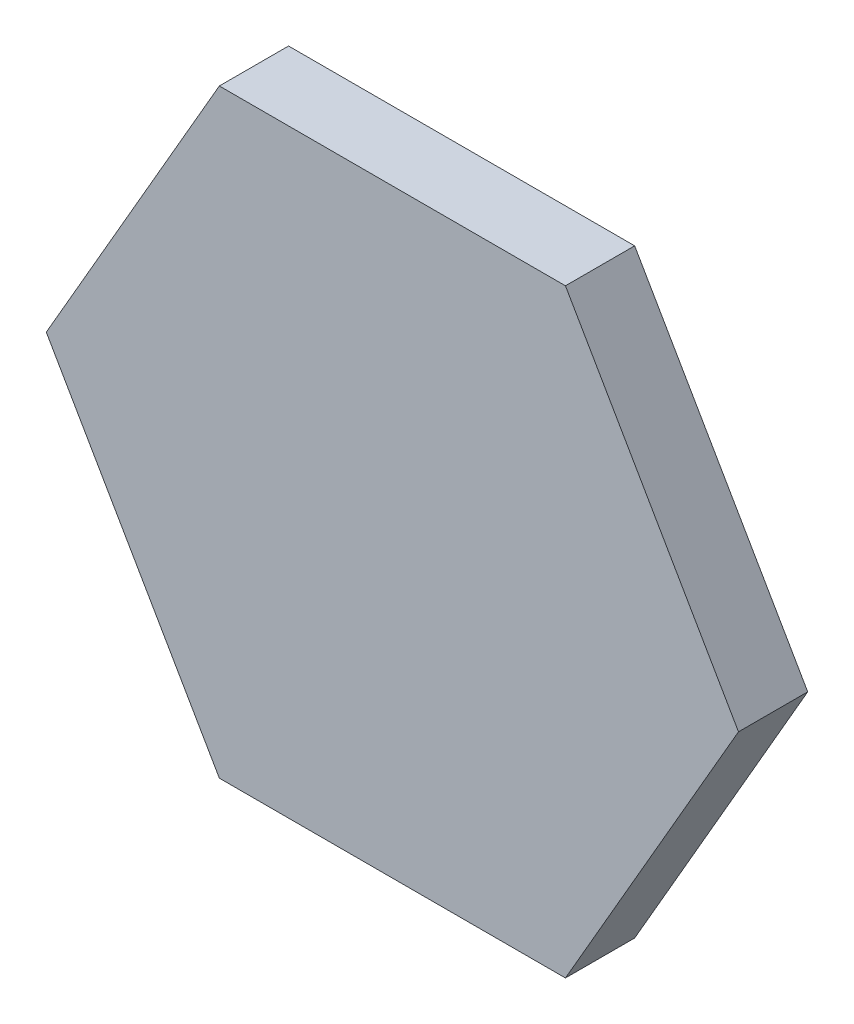
ISO-10303-21;
HEADER;
FILE_DESCRIPTION(('STEP AP214'),'2;1');
FILE_NAME('part.step','',(''),(''),'','','');
FILE_SCHEMA(('AUTOMOTIVE_DESIGN { 1 0 10303 214 1 1 1 1 }'));
ENDSEC;
DATA;
#1=APPLICATION_CONTEXT('core data for automotive mechanical design processes');
#2=APPLICATION_PROTOCOL_DEFINITION('international standard','automotive_design',2000,#1);
#3=PRODUCT_CONTEXT('',#1,'mechanical');
#4=PRODUCT('Part','Part','',(#3));
#5=PRODUCT_RELATED_PRODUCT_CATEGORY('part','',(#4));
#6=PRODUCT_DEFINITION_FORMATION('','',#4);
#7=PRODUCT_DEFINITION_CONTEXT('part definition',#1,'design');
#8=PRODUCT_DEFINITION('design','',#6,#7);
#9=PRODUCT_DEFINITION_SHAPE('','',#8);
#10=(LENGTH_UNIT() NAMED_UNIT(*) SI_UNIT(.MILLI.,.METRE.));
#11=(NAMED_UNIT(*) PLANE_ANGLE_UNIT() SI_UNIT($,.RADIAN.));
#12=(NAMED_UNIT(*) SI_UNIT($,.STERADIAN.) SOLID_ANGLE_UNIT());
#13=UNCERTAINTY_MEASURE_WITH_UNIT(LENGTH_MEASURE(1.E-05),#10,'distance_accuracy_value','');
#14=(GEOMETRIC_REPRESENTATION_CONTEXT(3) GLOBAL_UNCERTAINTY_ASSIGNED_CONTEXT((#13)) GLOBAL_UNIT_ASSIGNED_CONTEXT((#10,
#11,#12)) REPRESENTATION_CONTEXT('',''));
#15=CARTESIAN_POINT('',(0.,0.,0.));
#16=DIRECTION('',(0.,0.,1.));
#17=DIRECTION('',(1.,0.,0.));
#18=AXIS2_PLACEMENT_3D('',#15,#16,#17);
#19=CARTESIAN_POINT('',(-37.5,-64.9519052838329,15.));
#20=DIRECTION('',(0.,1.,0.));
#21=DIRECTION('',(0.,0.,1.));
#22=AXIS2_PLACEMENT_3D('',#19,#20,#21);
#23=PLANE('',#22);
#24=DIRECTION('',(1.,0.,0.));
#25=VECTOR('',#24,1.);
#26=CARTESIAN_POINT('',(-37.5,-64.9519052838329,0.));
#27=LINE('',#26,#25);
#28=CARTESIAN_POINT('',(-37.5,-64.9519052838329,0.));
#29=VERTEX_POINT('',#28);
#30=CARTESIAN_POINT('',(37.5,-64.9519052838329,0.));
#31=VERTEX_POINT('',#30);
#32=EDGE_CURVE('E117',#29,#31,#27,.T.);
#33=ORIENTED_EDGE('',*,*,#32,.T.);
#34=DIRECTION('',(0.,0.,-1.));
#35=VECTOR('',#34,1.);
#36=CARTESIAN_POINT('',(37.5,-64.9519052838329,15.));
#37=LINE('',#36,#35);
#38=CARTESIAN_POINT('',(37.5,-64.9519052838329,15.));
#39=VERTEX_POINT('',#38);
#40=EDGE_CURVE('E11',#39,#31,#37,.T.);
#41=ORIENTED_EDGE('',*,*,#40,.F.);
#42=DIRECTION('',(1.,0.,0.));
#43=VECTOR('',#42,1.);
#44=CARTESIAN_POINT('',(-37.5,-64.9519052838329,15.));
#45=LINE('',#44,#43);
#46=CARTESIAN_POINT('',(-37.5,-64.9519052838329,15.));
#47=VERTEX_POINT('',#46);
#48=EDGE_CURVE('E127',#47,#39,#45,.T.);
#49=ORIENTED_EDGE('',*,*,#48,.F.);
#50=DIRECTION('',(0.,0.,-1.));
#51=VECTOR('',#50,1.);
#52=CARTESIAN_POINT('',(-37.5,-64.9519052838329,15.));
#53=LINE('',#52,#51);
#54=EDGE_CURVE('E113',#47,#29,#53,.T.);
#55=ORIENTED_EDGE('',*,*,#54,.T.);
#56=EDGE_LOOP('',(#33,#41,#49,#55));
#57=FACE_BOUND('',#56,.T.);
#58=ADVANCED_FACE('F33',(#57),#23,.F.);
#59=CARTESIAN_POINT('',(37.5,-64.9519052838329,15.));
#60=DIRECTION('',(-0.866025403784438,0.5,0.));
#61=DIRECTION('',(-0.5,-0.866025403784439,0.));
#62=AXIS2_PLACEMENT_3D('',#59,#60,#61);
#63=PLANE('',#62);
#64=DIRECTION('',(0.5,0.866025403784438,0.));
#65=VECTOR('',#64,1.);
#66=CARTESIAN_POINT('',(37.5,-64.9519052838329,0.));
#67=LINE('',#66,#65);
#68=CARTESIAN_POINT('',(75.,0.,0.));
#69=VERTEX_POINT('',#68);
#70=EDGE_CURVE('E120',#31,#69,#67,.T.);
#71=ORIENTED_EDGE('',*,*,#70,.T.);
#72=DIRECTION('',(0.,0.,-1.));
#73=VECTOR('',#72,1.);
#74=CARTESIAN_POINT('',(75.,0.,15.));
#75=LINE('',#74,#73);
#76=CARTESIAN_POINT('',(75.,0.,15.));
#77=VERTEX_POINT('',#76);
#78=EDGE_CURVE('E41',#77,#69,#75,.T.);
#79=ORIENTED_EDGE('',*,*,#78,.F.);
#80=DIRECTION('',(0.5,0.866025403784438,0.));
#81=VECTOR('',#80,1.);
#82=CARTESIAN_POINT('',(37.5,-64.9519052838329,15.));
#83=LINE('',#82,#81);
#84=EDGE_CURVE('E86',#39,#77,#83,.T.);
#85=ORIENTED_EDGE('',*,*,#84,.F.);
#86=ORIENTED_EDGE('',*,*,#40,.T.);
#87=EDGE_LOOP('',(#71,#79,#85,#86));
#88=FACE_BOUND('',#87,.T.);
#89=ADVANCED_FACE('F151',(#88),#63,.F.);
#90=CARTESIAN_POINT('',(75.,0.,15.));
#91=DIRECTION('',(-0.866025403784439,-0.5,0.));
#92=DIRECTION('',(0.5,-0.866025403784439,0.));
#93=AXIS2_PLACEMENT_3D('',#90,#91,#92);
#94=PLANE('',#93);
#95=DIRECTION('',(-0.5,0.866025403784439,0.));
#96=VECTOR('',#95,1.);
#97=CARTESIAN_POINT('',(75.,0.,0.));
#98=LINE('',#97,#96);
#99=CARTESIAN_POINT('',(37.5,64.9519052838329,0.));
#100=VERTEX_POINT('',#99);
#101=EDGE_CURVE('E122',#69,#100,#98,.T.);
#102=ORIENTED_EDGE('',*,*,#101,.T.);
#103=DIRECTION('',(0.,0.,-1.));
#104=VECTOR('',#103,1.);
#105=CARTESIAN_POINT('',(37.5,64.9519052838329,15.));
#106=LINE('',#105,#104);
#107=CARTESIAN_POINT('',(37.5,64.9519052838329,15.));
#108=VERTEX_POINT('',#107);
#109=EDGE_CURVE('E108',#108,#100,#106,.T.);
#110=ORIENTED_EDGE('',*,*,#109,.F.);
#111=DIRECTION('',(-0.5,0.866025403784439,0.));
#112=VECTOR('',#111,1.);
#113=CARTESIAN_POINT('',(75.,0.,15.));
#114=LINE('',#113,#112);
#115=EDGE_CURVE('E99',#77,#108,#114,.T.);
#116=ORIENTED_EDGE('',*,*,#115,.F.);
#117=ORIENTED_EDGE('',*,*,#78,.T.);
#118=EDGE_LOOP('',(#102,#110,#116,#117));
#119=FACE_BOUND('',#118,.T.);
#120=ADVANCED_FACE('F133',(#119),#94,.F.);
#121=CARTESIAN_POINT('',(37.5,64.9519052838329,15.));
#122=DIRECTION('',(0.,-1.,0.));
#123=DIRECTION('',(0.,0.,-1.));
#124=AXIS2_PLACEMENT_3D('',#121,#122,#123);
#125=PLANE('',#124);
#126=DIRECTION('',(-1.,0.,0.));
#127=VECTOR('',#126,1.);
#128=CARTESIAN_POINT('',(37.5,64.9519052838329,0.));
#129=LINE('',#128,#127);
#130=CARTESIAN_POINT('',(-37.5,64.9519052838329,0.));
#131=VERTEX_POINT('',#130);
#132=EDGE_CURVE('E107',#100,#131,#129,.T.);
#133=ORIENTED_EDGE('',*,*,#132,.T.);
#134=DIRECTION('',(0.,0.,-1.));
#135=VECTOR('',#134,1.);
#136=CARTESIAN_POINT('',(-37.5,64.9519052838329,15.));
#137=LINE('',#136,#135);
#138=CARTESIAN_POINT('',(-37.5,64.9519052838329,15.));
#139=VERTEX_POINT('',#138);
#140=EDGE_CURVE('E104',#139,#131,#137,.T.);
#141=ORIENTED_EDGE('',*,*,#140,.F.);
#142=DIRECTION('',(-1.,0.,0.));
#143=VECTOR('',#142,1.);
#144=CARTESIAN_POINT('',(37.5,64.9519052838329,15.));
#145=LINE('',#144,#143);
#146=EDGE_CURVE('E93',#108,#139,#145,.T.);
#147=ORIENTED_EDGE('',*,*,#146,.F.);
#148=ORIENTED_EDGE('',*,*,#109,.T.);
#149=EDGE_LOOP('',(#133,#141,#147,#148));
#150=FACE_BOUND('',#149,.T.);
#151=ADVANCED_FACE('F105',(#150),#125,.F.);
#152=CARTESIAN_POINT('',(-37.5,64.9519052838329,15.));
#153=DIRECTION('',(0.866025403784439,-0.5,0.));
#154=DIRECTION('',(0.5,0.866025403784439,0.));
#155=AXIS2_PLACEMENT_3D('',#152,#153,#154);
#156=PLANE('',#155);
#157=DIRECTION('',(-0.5,-0.866025403784439,0.));
#158=VECTOR('',#157,1.);
#159=CARTESIAN_POINT('',(-37.5,64.9519052838329,0.));
#160=LINE('',#159,#158);
#161=CARTESIAN_POINT('',(-75.,0.,0.));
#162=VERTEX_POINT('',#161);
#163=EDGE_CURVE('E72',#131,#162,#160,.T.);
#164=ORIENTED_EDGE('',*,*,#163,.T.);
#165=DIRECTION('',(0.,0.,-1.));
#166=VECTOR('',#165,1.);
#167=CARTESIAN_POINT('',(-75.,0.,15.));
#168=LINE('',#167,#166);
#169=CARTESIAN_POINT('',(-75.,0.,15.));
#170=VERTEX_POINT('',#169);
#171=EDGE_CURVE('E109',#170,#162,#168,.T.);
#172=ORIENTED_EDGE('',*,*,#171,.F.);
#173=DIRECTION('',(-0.5,-0.866025403784439,0.));
#174=VECTOR('',#173,1.);
#175=CARTESIAN_POINT('',(-37.5,64.9519052838329,15.));
#176=LINE('',#175,#174);
#177=EDGE_CURVE('E97',#139,#170,#176,.T.);
#178=ORIENTED_EDGE('',*,*,#177,.F.);
#179=ORIENTED_EDGE('',*,*,#140,.T.);
#180=EDGE_LOOP('',(#164,#172,#178,#179));
#181=FACE_BOUND('',#180,.T.);
#182=ADVANCED_FACE('F111',(#181),#156,.F.);
#183=CARTESIAN_POINT('',(-75.,0.,15.));
#184=DIRECTION('',(0.866025403784439,0.5,0.));
#185=DIRECTION('',(-0.5,0.866025403784439,0.));
#186=AXIS2_PLACEMENT_3D('',#183,#184,#185);
#187=PLANE('',#186);
#188=DIRECTION('',(0.5,-0.866025403784439,0.));
#189=VECTOR('',#188,1.);
#190=CARTESIAN_POINT('',(-75.,0.,0.));
#191=LINE('',#190,#189);
#192=EDGE_CURVE('E78',#162,#29,#191,.T.);
#193=ORIENTED_EDGE('',*,*,#192,.T.);
#194=ORIENTED_EDGE('',*,*,#54,.F.);
#195=DIRECTION('',(0.5,-0.866025403784439,0.));
#196=VECTOR('',#195,1.);
#197=CARTESIAN_POINT('',(-75.,0.,15.));
#198=LINE('',#197,#196);
#199=EDGE_CURVE('E49',#170,#47,#198,.T.);
#200=ORIENTED_EDGE('',*,*,#199,.F.);
#201=ORIENTED_EDGE('',*,*,#171,.T.);
#202=EDGE_LOOP('',(#193,#194,#200,#201));
#203=FACE_BOUND('',#202,.T.);
#204=ADVANCED_FACE('F140',(#203),#187,.F.);
#205=CARTESIAN_POINT('',(0.,0.,15.));
#206=DIRECTION('',(0.,0.,1.));
#207=DIRECTION('',(1.,0.,0.));
#208=AXIS2_PLACEMENT_3D('',#205,#206,#207);
#209=PLANE('',#208);
#210=ORIENTED_EDGE('',*,*,#48,.T.);
#211=ORIENTED_EDGE('',*,*,#84,.T.);
#212=ORIENTED_EDGE('',*,*,#115,.T.);
#213=ORIENTED_EDGE('',*,*,#146,.T.);
#214=ORIENTED_EDGE('',*,*,#177,.T.);
#215=ORIENTED_EDGE('',*,*,#199,.T.);
#216=EDGE_LOOP('',(#210,#211,#212,#213,#214,#215));
#217=FACE_BOUND('',#216,.T.);
#218=ADVANCED_FACE('F95',(#217),#209,.T.);
#219=CARTESIAN_POINT('',(0.,0.,0.));
#220=DIRECTION('',(0.,0.,1.));
#221=DIRECTION('',(1.,0.,0.));
#222=AXIS2_PLACEMENT_3D('',#219,#220,#221);
#223=PLANE('',#222);
#224=ORIENTED_EDGE('',*,*,#32,.F.);
#225=ORIENTED_EDGE('',*,*,#192,.F.);
#226=ORIENTED_EDGE('',*,*,#163,.F.);
#227=ORIENTED_EDGE('',*,*,#132,.F.);
#228=ORIENTED_EDGE('',*,*,#101,.F.);
#229=ORIENTED_EDGE('',*,*,#70,.F.);
#230=EDGE_LOOP('',(#224,#225,#226,#227,#228,#229));
#231=FACE_BOUND('',#230,.T.);
#232=ADVANCED_FACE('F136',(#231),#223,.F.);
#233=CLOSED_SHELL('',(#58,#89,#120,#151,#182,#204,#218,#232));
#234=MANIFOLD_SOLID_BREP('B2',#233);
#235=ADVANCED_BREP_SHAPE_REPRESENTATION('',(#18,#234),#14);
#236=SHAPE_DEFINITION_REPRESENTATION(#9,#235);
ENDSEC;
END-ISO-10303-21;
